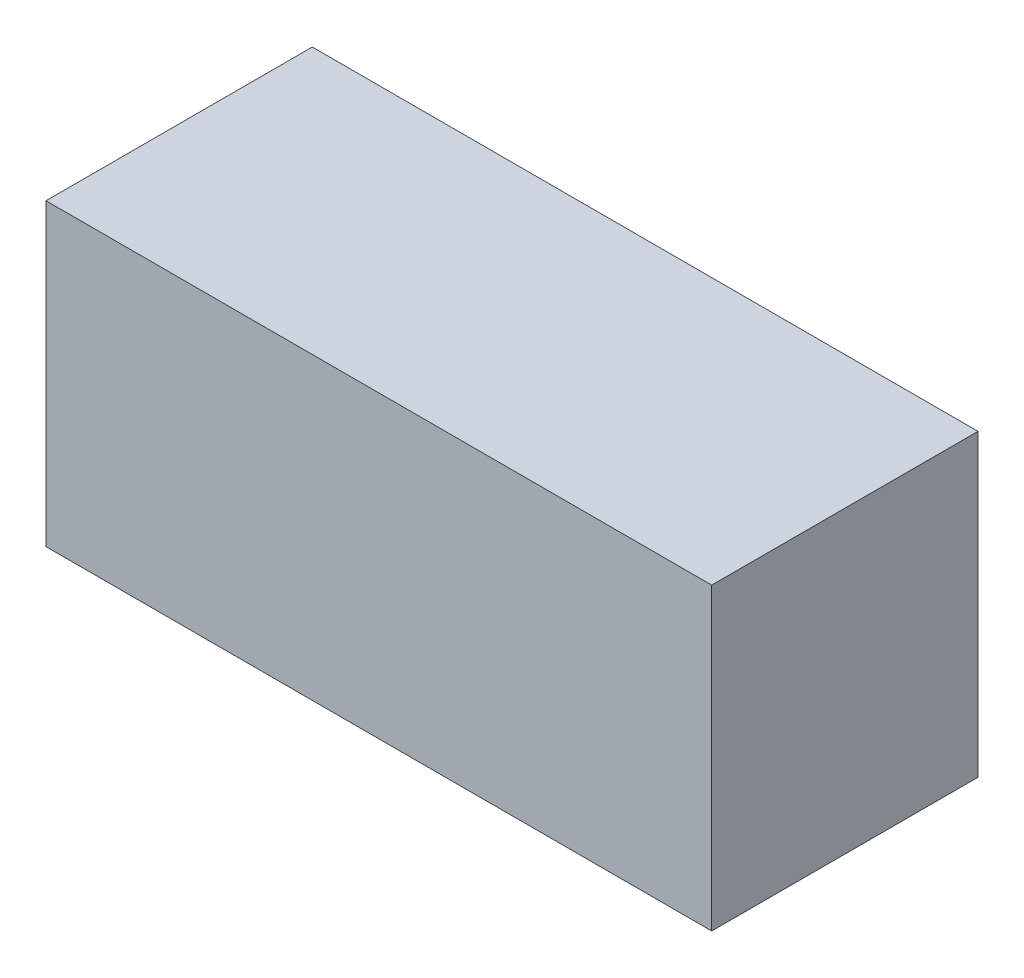
ISO-10303-21;
HEADER;
FILE_DESCRIPTION(('STEP AP214'),'2;1');
FILE_NAME('part.step','',(''),(''),'','','');
FILE_SCHEMA(('AUTOMOTIVE_DESIGN { 1 0 10303 214 1 1 1 1 }'));
ENDSEC;
DATA;
#1=APPLICATION_CONTEXT('core data for automotive mechanical design processes');
#2=APPLICATION_PROTOCOL_DEFINITION('international standard','automotive_design',2000,#1);
#3=PRODUCT_CONTEXT('',#1,'mechanical');
#4=PRODUCT('Part','Part','',(#3));
#5=PRODUCT_RELATED_PRODUCT_CATEGORY('part','',(#4));
#6=PRODUCT_DEFINITION_FORMATION('','',#4);
#7=PRODUCT_DEFINITION_CONTEXT('part definition',#1,'design');
#8=PRODUCT_DEFINITION('design','',#6,#7);
#9=PRODUCT_DEFINITION_SHAPE('','',#8);
#10=(LENGTH_UNIT() NAMED_UNIT(*) SI_UNIT(.MILLI.,.METRE.));
#11=(NAMED_UNIT(*) PLANE_ANGLE_UNIT() SI_UNIT($,.RADIAN.));
#12=(NAMED_UNIT(*) SI_UNIT($,.STERADIAN.) SOLID_ANGLE_UNIT());
#13=UNCERTAINTY_MEASURE_WITH_UNIT(LENGTH_MEASURE(1.E-05),#10,'distance_accuracy_value','');
#14=(GEOMETRIC_REPRESENTATION_CONTEXT(3) GLOBAL_UNCERTAINTY_ASSIGNED_CONTEXT((#13)) GLOBAL_UNIT_ASSIGNED_CONTEXT((#10,
#11,#12)) REPRESENTATION_CONTEXT('',''));
#15=CARTESIAN_POINT('',(0.,0.,0.));
#16=DIRECTION('',(0.,0.,1.));
#17=DIRECTION('',(1.,0.,0.));
#18=AXIS2_PLACEMENT_3D('',#15,#16,#17);
#19=CARTESIAN_POINT('',(0.,45.,0.));
#20=DIRECTION('',(1.,0.,0.));
#21=DIRECTION('',(0.,0.,-1.));
#22=AXIS2_PLACEMENT_3D('',#19,#20,#21);
#23=PLANE('',#22);
#24=DIRECTION('',(0.,0.,1.));
#25=VECTOR('',#24,1.);
#26=CARTESIAN_POINT('',(0.,0.,0.));
#27=LINE('',#26,#25);
#28=CARTESIAN_POINT('',(0.,0.,-40.));
#29=VERTEX_POINT('',#28);
#30=CARTESIAN_POINT('',(0.,0.,0.));
#31=VERTEX_POINT('',#30);
#32=EDGE_CURVE('E96',#29,#31,#27,.T.);
#33=ORIENTED_EDGE('',*,*,#32,.T.);
#34=DIRECTION('',(0.,-1.,0.));
#35=VECTOR('',#34,1.);
#36=CARTESIAN_POINT('',(0.,45.,0.));
#37=LINE('',#36,#35);
#38=CARTESIAN_POINT('',(0.,45.,0.));
#39=VERTEX_POINT('',#38);
#40=EDGE_CURVE('E11',#39,#31,#37,.T.);
#41=ORIENTED_EDGE('',*,*,#40,.F.);
#42=DIRECTION('',(0.,0.,1.));
#43=VECTOR('',#42,1.);
#44=CARTESIAN_POINT('',(0.,45.,0.));
#45=LINE('',#44,#43);
#46=CARTESIAN_POINT('',(0.,45.,-40.));
#47=VERTEX_POINT('',#46);
#48=EDGE_CURVE('E84',#47,#39,#45,.T.);
#49=ORIENTED_EDGE('',*,*,#48,.F.);
#50=DIRECTION('',(0.,-1.,0.));
#51=VECTOR('',#50,1.);
#52=CARTESIAN_POINT('',(0.,45.,-40.));
#53=LINE('',#52,#51);
#54=EDGE_CURVE('E92',#47,#29,#53,.T.);
#55=ORIENTED_EDGE('',*,*,#54,.T.);
#56=EDGE_LOOP('',(#33,#41,#49,#55));
#57=FACE_BOUND('',#56,.T.);
#58=ADVANCED_FACE('F33',(#57),#23,.F.);
#59=CARTESIAN_POINT('',(0.,45.,0.));
#60=DIRECTION('',(0.,0.,-1.));
#61=DIRECTION('',(-1.,0.,0.));
#62=AXIS2_PLACEMENT_3D('',#59,#60,#61);
#63=PLANE('',#62);
#64=DIRECTION('',(1.,0.,0.));
#65=VECTOR('',#64,1.);
#66=CARTESIAN_POINT('',(0.,0.,0.));
#67=LINE('',#66,#65);
#68=CARTESIAN_POINT('',(100.,0.,0.));
#69=VERTEX_POINT('',#68);
#70=EDGE_CURVE('E88',#31,#69,#67,.T.);
#71=ORIENTED_EDGE('',*,*,#70,.T.);
#72=DIRECTION('',(0.,-1.,0.));
#73=VECTOR('',#72,1.);
#74=CARTESIAN_POINT('',(100.,45.,0.));
#75=LINE('',#74,#73);
#76=CARTESIAN_POINT('',(100.,45.,0.));
#77=VERTEX_POINT('',#76);
#78=EDGE_CURVE('E41',#77,#69,#75,.T.);
#79=ORIENTED_EDGE('',*,*,#78,.F.);
#80=DIRECTION('',(1.,0.,0.));
#81=VECTOR('',#80,1.);
#82=CARTESIAN_POINT('',(0.,45.,0.));
#83=LINE('',#82,#81);
#84=EDGE_CURVE('E79',#39,#77,#83,.T.);
#85=ORIENTED_EDGE('',*,*,#84,.F.);
#86=ORIENTED_EDGE('',*,*,#40,.T.);
#87=EDGE_LOOP('',(#71,#79,#85,#86));
#88=FACE_BOUND('',#87,.T.);
#89=ADVANCED_FACE('F87',(#88),#63,.F.);
#90=CARTESIAN_POINT('',(100.,45.,0.));
#91=DIRECTION('',(-1.,0.,0.));
#92=DIRECTION('',(0.,0.,1.));
#93=AXIS2_PLACEMENT_3D('',#90,#91,#92);
#94=PLANE('',#93);
#95=DIRECTION('',(0.,0.,-1.));
#96=VECTOR('',#95,1.);
#97=CARTESIAN_POINT('',(100.,0.,0.));
#98=LINE('',#97,#96);
#99=CARTESIAN_POINT('',(100.,0.,-40.));
#100=VERTEX_POINT('',#99);
#101=EDGE_CURVE('E66',#69,#100,#98,.T.);
#102=ORIENTED_EDGE('',*,*,#101,.T.);
#103=DIRECTION('',(0.,-1.,0.));
#104=VECTOR('',#103,1.);
#105=CARTESIAN_POINT('',(100.,45.,-40.));
#106=LINE('',#105,#104);
#107=CARTESIAN_POINT('',(100.,45.,-40.));
#108=VERTEX_POINT('',#107);
#109=EDGE_CURVE('E89',#108,#100,#106,.T.);
#110=ORIENTED_EDGE('',*,*,#109,.F.);
#111=DIRECTION('',(0.,0.,-1.));
#112=VECTOR('',#111,1.);
#113=CARTESIAN_POINT('',(100.,45.,0.));
#114=LINE('',#113,#112);
#115=EDGE_CURVE('E82',#77,#108,#114,.T.);
#116=ORIENTED_EDGE('',*,*,#115,.F.);
#117=ORIENTED_EDGE('',*,*,#78,.T.);
#118=EDGE_LOOP('',(#102,#110,#116,#117));
#119=FACE_BOUND('',#118,.T.);
#120=ADVANCED_FACE('F90',(#119),#94,.F.);
#121=CARTESIAN_POINT('',(0.,45.,-40.));
#122=DIRECTION('',(0.,0.,1.));
#123=DIRECTION('',(1.,0.,0.));
#124=AXIS2_PLACEMENT_3D('',#121,#122,#123);
#125=PLANE('',#124);
#126=DIRECTION('',(-1.,0.,0.));
#127=VECTOR('',#126,1.);
#128=CARTESIAN_POINT('',(0.,0.,-40.));
#129=LINE('',#128,#127);
#130=EDGE_CURVE('E72',#100,#29,#129,.T.);
#131=ORIENTED_EDGE('',*,*,#130,.T.);
#132=ORIENTED_EDGE('',*,*,#54,.F.);
#133=DIRECTION('',(-1.,0.,0.));
#134=VECTOR('',#133,1.);
#135=CARTESIAN_POINT('',(0.,45.,-40.));
#136=LINE('',#135,#134);
#137=EDGE_CURVE('E49',#108,#47,#136,.T.);
#138=ORIENTED_EDGE('',*,*,#137,.F.);
#139=ORIENTED_EDGE('',*,*,#109,.T.);
#140=EDGE_LOOP('',(#131,#132,#138,#139));
#141=FACE_BOUND('',#140,.T.);
#142=ADVANCED_FACE('F103',(#141),#125,.F.);
#143=CARTESIAN_POINT('',(0.,45.,0.));
#144=DIRECTION('',(0.,-1.,0.));
#145=DIRECTION('',(0.,0.,-1.));
#146=AXIS2_PLACEMENT_3D('',#143,#144,#145);
#147=PLANE('',#146);
#148=ORIENTED_EDGE('',*,*,#48,.T.);
#149=ORIENTED_EDGE('',*,*,#84,.T.);
#150=ORIENTED_EDGE('',*,*,#115,.T.);
#151=ORIENTED_EDGE('',*,*,#137,.T.);
#152=EDGE_LOOP('',(#148,#149,#150,#151));
#153=FACE_BOUND('',#152,.T.);
#154=ADVANCED_FACE('F80',(#153),#147,.F.);
#155=CARTESIAN_POINT('',(0.,0.,0.));
#156=DIRECTION('',(0.,-1.,0.));
#157=DIRECTION('',(0.,0.,-1.));
#158=AXIS2_PLACEMENT_3D('',#155,#156,#157);
#159=PLANE('',#158);
#160=ORIENTED_EDGE('',*,*,#32,.F.);
#161=ORIENTED_EDGE('',*,*,#130,.F.);
#162=ORIENTED_EDGE('',*,*,#101,.F.);
#163=ORIENTED_EDGE('',*,*,#70,.F.);
#164=EDGE_LOOP('',(#160,#161,#162,#163));
#165=FACE_BOUND('',#164,.T.);
#166=ADVANCED_FACE('F106',(#165),#159,.T.);
#167=CLOSED_SHELL('',(#58,#89,#120,#142,#154,#166));
#168=MANIFOLD_SOLID_BREP('B2',#167);
#169=ADVANCED_BREP_SHAPE_REPRESENTATION('',(#18,#168),#14);
#170=SHAPE_DEFINITION_REPRESENTATION(#9,#169);
ENDSEC;
END-ISO-10303-21;
